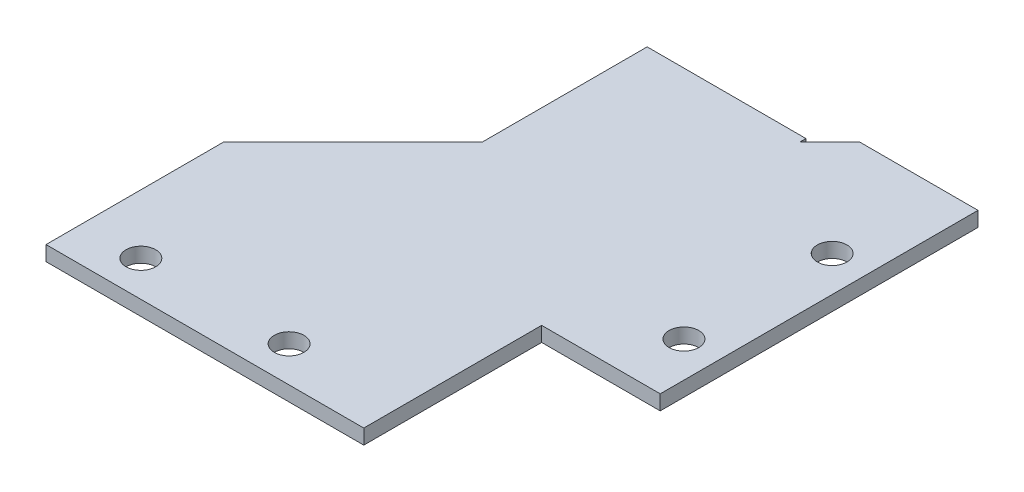
ISO-10303-21;
HEADER;
FILE_DESCRIPTION(('STEP AP214'),'2;1');
FILE_NAME('part.step','',(''),(''),'','','');
FILE_SCHEMA(('AUTOMOTIVE_DESIGN { 1 0 10303 214 1 1 1 1 }'));
ENDSEC;
DATA;
#1=APPLICATION_CONTEXT('core data for automotive mechanical design processes');
#2=APPLICATION_PROTOCOL_DEFINITION('international standard','automotive_design',2000,#1);
#3=PRODUCT_CONTEXT('',#1,'mechanical');
#4=PRODUCT('Part','Part','',(#3));
#5=PRODUCT_RELATED_PRODUCT_CATEGORY('part','',(#4));
#6=PRODUCT_DEFINITION_FORMATION('','',#4);
#7=PRODUCT_DEFINITION_CONTEXT('part definition',#1,'design');
#8=PRODUCT_DEFINITION('design','',#6,#7);
#9=PRODUCT_DEFINITION_SHAPE('','',#8);
#10=(LENGTH_UNIT() NAMED_UNIT(*) SI_UNIT(.MILLI.,.METRE.));
#11=(NAMED_UNIT(*) PLANE_ANGLE_UNIT() SI_UNIT($,.RADIAN.));
#12=(NAMED_UNIT(*) SI_UNIT($,.STERADIAN.) SOLID_ANGLE_UNIT());
#13=UNCERTAINTY_MEASURE_WITH_UNIT(LENGTH_MEASURE(1.E-05),#10,'distance_accuracy_value','');
#14=(GEOMETRIC_REPRESENTATION_CONTEXT(3) GLOBAL_UNCERTAINTY_ASSIGNED_CONTEXT((#13)) GLOBAL_UNIT_ASSIGNED_CONTEXT((#10,
#11,#12)) REPRESENTATION_CONTEXT('',''));
#15=CARTESIAN_POINT('',(0.,0.,0.));
#16=DIRECTION('',(0.,0.,1.));
#17=DIRECTION('',(1.,0.,0.));
#18=AXIS2_PLACEMENT_3D('',#15,#16,#17);
#19=CARTESIAN_POINT('',(-19.05,3.175,-19.05));
#20=DIRECTION('',(-0.707106781186548,0.,-0.707106781186548));
#21=DIRECTION('',(-0.707106781186548,0.,0.707106781186548));
#22=AXIS2_PLACEMENT_3D('',#19,#20,#21);
#23=PLANE('',#22);
#24=DIRECTION('',(0.,1.,0.));
#25=VECTOR('',#24,1.);
#26=CARTESIAN_POINT('',(27.7114,3.175,-65.8114));
#27=LINE('',#26,#25);
#28=CARTESIAN_POINT('',(27.7114,0.,-65.8114));
#29=VERTEX_POINT('',#28);
#30=CARTESIAN_POINT('',(27.7114,3.175,-65.8114));
#31=VERTEX_POINT('',#30);
#32=EDGE_CURVE('E167',#29,#31,#27,.T.);
#33=ORIENTED_EDGE('',*,*,#32,.F.);
#34=DIRECTION('',(0.707106781186548,0.,-0.707106781186548));
#35=VECTOR('',#34,1.);
#36=CARTESIAN_POINT('',(-19.05,0.,-19.05));
#37=LINE('',#36,#35);
#38=CARTESIAN_POINT('',(0.,0.,-38.1));
#39=VERTEX_POINT('',#38);
#40=EDGE_CURVE('E232',#39,#29,#37,.T.);
#41=ORIENTED_EDGE('',*,*,#40,.F.);
#42=DIRECTION('',(0.,-1.,0.));
#43=VECTOR('',#42,1.);
#44=CARTESIAN_POINT('',(0.,3.175,-38.1));
#45=LINE('',#44,#43);
#46=CARTESIAN_POINT('',(0.,3.175,-38.1));
#47=VERTEX_POINT('',#46);
#48=EDGE_CURVE('E238',#47,#39,#45,.T.);
#49=ORIENTED_EDGE('',*,*,#48,.F.);
#50=DIRECTION('',(0.707106781186548,0.,-0.707106781186548));
#51=VECTOR('',#50,1.);
#52=CARTESIAN_POINT('',(-19.05,3.175,-19.05));
#53=LINE('',#52,#51);
#54=EDGE_CURVE('E61',#47,#31,#53,.T.);
#55=ORIENTED_EDGE('',*,*,#54,.T.);
#56=EDGE_LOOP('',(#33,#41,#49,#55));
#57=FACE_BOUND('',#56,.T.);
#58=ADVANCED_FACE('F45',(#57),#23,.T.);
#59=CARTESIAN_POINT('',(0.,3.175,0.));
#60=DIRECTION('',(0.,0.,-1.));
#61=DIRECTION('',(-1.,0.,0.));
#62=AXIS2_PLACEMENT_3D('',#59,#60,#61);
#63=PLANE('',#62);
#64=DIRECTION('',(1.,0.,0.));
#65=VECTOR('',#64,1.);
#66=CARTESIAN_POINT('',(0.,0.,0.));
#67=LINE('',#66,#65);
#68=CARTESIAN_POINT('',(0.,0.,0.));
#69=VERTEX_POINT('',#68);
#70=CARTESIAN_POINT('',(68.072,0.,0.));
#71=VERTEX_POINT('',#70);
#72=EDGE_CURVE('E193',#69,#71,#67,.T.);
#73=ORIENTED_EDGE('',*,*,#72,.T.);
#74=DIRECTION('',(0.,-1.,0.));
#75=VECTOR('',#74,1.);
#76=CARTESIAN_POINT('',(68.072,3.175,0.));
#77=LINE('',#76,#75);
#78=CARTESIAN_POINT('',(68.072,3.175,0.));
#79=VERTEX_POINT('',#78);
#80=EDGE_CURVE('E11',#79,#71,#77,.T.);
#81=ORIENTED_EDGE('',*,*,#80,.F.);
#82=DIRECTION('',(1.,0.,0.));
#83=VECTOR('',#82,1.);
#84=CARTESIAN_POINT('',(0.,3.175,0.));
#85=LINE('',#84,#83);
#86=CARTESIAN_POINT('',(0.,3.175,0.));
#87=VERTEX_POINT('',#86);
#88=EDGE_CURVE('E196',#87,#79,#85,.T.);
#89=ORIENTED_EDGE('',*,*,#88,.F.);
#90=DIRECTION('',(0.,-1.,0.));
#91=VECTOR('',#90,1.);
#92=CARTESIAN_POINT('',(0.,3.175,0.));
#93=LINE('',#92,#91);
#94=EDGE_CURVE('E217',#87,#69,#93,.T.);
#95=ORIENTED_EDGE('',*,*,#94,.T.);
#96=EDGE_LOOP('',(#73,#81,#89,#95));
#97=FACE_BOUND('',#96,.T.);
#98=ADVANCED_FACE('F47',(#97),#63,.F.);
#99=CARTESIAN_POINT('',(68.072,3.175,0.));
#100=DIRECTION('',(-1.,0.,0.));
#101=DIRECTION('',(0.,0.,1.));
#102=AXIS2_PLACEMENT_3D('',#99,#100,#101);
#103=PLANE('',#102);
#104=DIRECTION('',(0.,0.,-1.));
#105=VECTOR('',#104,1.);
#106=CARTESIAN_POINT('',(68.072,0.,0.));
#107=LINE('',#106,#105);
#108=CARTESIAN_POINT('',(68.072,0.,-38.1));
#109=VERTEX_POINT('',#108);
#110=EDGE_CURVE('E221',#71,#109,#107,.T.);
#111=ORIENTED_EDGE('',*,*,#110,.T.);
#112=DIRECTION('',(0.,-1.,0.));
#113=VECTOR('',#112,1.);
#114=CARTESIAN_POINT('',(68.072,3.175,-38.1));
#115=LINE('',#114,#113);
#116=CARTESIAN_POINT('',(68.072,3.175,-38.1));
#117=VERTEX_POINT('',#116);
#118=EDGE_CURVE('E54',#117,#109,#115,.T.);
#119=ORIENTED_EDGE('',*,*,#118,.F.);
#120=DIRECTION('',(0.,0.,-1.));
#121=VECTOR('',#120,1.);
#122=CARTESIAN_POINT('',(68.072,3.175,0.));
#123=LINE('',#122,#121);
#124=EDGE_CURVE('E200',#79,#117,#123,.T.);
#125=ORIENTED_EDGE('',*,*,#124,.F.);
#126=ORIENTED_EDGE('',*,*,#80,.T.);
#127=EDGE_LOOP('',(#111,#119,#125,#126));
#128=FACE_BOUND('',#127,.T.);
#129=ADVANCED_FACE('F268',(#128),#103,.F.);
#130=CARTESIAN_POINT('',(0.,3.175,-38.1));
#131=DIRECTION('',(0.,0.,-1.));
#132=DIRECTION('',(-1.,0.,0.));
#133=AXIS2_PLACEMENT_3D('',#130,#131,#132);
#134=PLANE('',#133);
#135=DIRECTION('',(1.,0.,0.));
#136=VECTOR('',#135,1.);
#137=CARTESIAN_POINT('',(0.,0.,-38.1));
#138=LINE('',#137,#136);
#139=CARTESIAN_POINT('',(93.472,0.,-38.1));
#140=VERTEX_POINT('',#139);
#141=EDGE_CURVE('E224',#109,#140,#138,.T.);
#142=ORIENTED_EDGE('',*,*,#141,.T.);
#143=DIRECTION('',(0.,-1.,0.));
#144=VECTOR('',#143,1.);
#145=CARTESIAN_POINT('',(93.472,3.175,-38.1));
#146=LINE('',#145,#144);
#147=CARTESIAN_POINT('',(93.472,3.175,-38.1));
#148=VERTEX_POINT('',#147);
#149=EDGE_CURVE('E244',#148,#140,#146,.T.);
#150=ORIENTED_EDGE('',*,*,#149,.F.);
#151=DIRECTION('',(1.,0.,0.));
#152=VECTOR('',#151,1.);
#153=CARTESIAN_POINT('',(0.,3.175,-38.1));
#154=LINE('',#153,#152);
#155=EDGE_CURVE('E204',#117,#148,#154,.T.);
#156=ORIENTED_EDGE('',*,*,#155,.F.);
#157=ORIENTED_EDGE('',*,*,#118,.T.);
#158=EDGE_LOOP('',(#142,#150,#156,#157));
#159=FACE_BOUND('',#158,.T.);
#160=ADVANCED_FACE('F251',(#159),#134,.F.);
#161=CARTESIAN_POINT('',(93.472,3.175,0.));
#162=DIRECTION('',(-1.,0.,0.));
#163=DIRECTION('',(0.,0.,1.));
#164=AXIS2_PLACEMENT_3D('',#161,#162,#163);
#165=PLANE('',#164);
#166=DIRECTION('',(0.,0.,-1.));
#167=VECTOR('',#166,1.);
#168=CARTESIAN_POINT('',(93.472,0.,0.));
#169=LINE('',#168,#167);
#170=CARTESIAN_POINT('',(93.472,0.,-106.172));
#171=VERTEX_POINT('',#170);
#172=EDGE_CURVE('E226',#140,#171,#169,.T.);
#173=ORIENTED_EDGE('',*,*,#172,.T.);
#174=DIRECTION('',(0.,-1.,0.));
#175=VECTOR('',#174,1.);
#176=CARTESIAN_POINT('',(93.472,3.175,-106.172));
#177=LINE('',#176,#175);
#178=CARTESIAN_POINT('',(93.472,3.175,-106.172));
#179=VERTEX_POINT('',#178);
#180=EDGE_CURVE('E242',#179,#171,#177,.T.);
#181=ORIENTED_EDGE('',*,*,#180,.F.);
#182=DIRECTION('',(0.,0.,-1.));
#183=VECTOR('',#182,1.);
#184=CARTESIAN_POINT('',(93.472,3.175,0.));
#185=LINE('',#184,#183);
#186=EDGE_CURVE('E206',#148,#179,#185,.T.);
#187=ORIENTED_EDGE('',*,*,#186,.F.);
#188=ORIENTED_EDGE('',*,*,#149,.T.);
#189=EDGE_LOOP('',(#173,#181,#187,#188));
#190=FACE_BOUND('',#189,.T.);
#191=ADVANCED_FACE('F259',(#190),#165,.F.);
#192=CARTESIAN_POINT('',(0.,3.175,-106.172));
#193=DIRECTION('',(0.,0.,-1.));
#194=DIRECTION('',(-1.,0.,0.));
#195=AXIS2_PLACEMENT_3D('',#192,#193,#194);
#196=PLANE('',#195);
#197=DIRECTION('',(1.,0.,0.));
#198=VECTOR('',#197,1.);
#199=CARTESIAN_POINT('',(0.,0.,-106.172));
#200=LINE('',#199,#198);
#201=CARTESIAN_POINT('',(68.072,0.,-106.172));
#202=VERTEX_POINT('',#201);
#203=EDGE_CURVE('E229',#202,#171,#200,.T.);
#204=ORIENTED_EDGE('',*,*,#203,.F.);
#205=DIRECTION('',(0.,-1.,0.));
#206=VECTOR('',#205,1.);
#207=CARTESIAN_POINT('',(68.072,3.175,-106.172));
#208=LINE('',#207,#206);
#209=CARTESIAN_POINT('',(68.072,3.175,-106.172));
#210=VERTEX_POINT('',#209);
#211=EDGE_CURVE('E240',#210,#202,#208,.T.);
#212=ORIENTED_EDGE('',*,*,#211,.F.);
#213=DIRECTION('',(1.,0.,0.));
#214=VECTOR('',#213,1.);
#215=CARTESIAN_POINT('',(0.,3.175,-106.172));
#216=LINE('',#215,#214);
#217=EDGE_CURVE('E208',#210,#179,#216,.T.);
#218=ORIENTED_EDGE('',*,*,#217,.T.);
#219=ORIENTED_EDGE('',*,*,#180,.T.);
#220=EDGE_LOOP('',(#204,#212,#218,#219));
#221=FACE_BOUND('',#220,.T.);
#222=ADVANCED_FACE('F280',(#221),#196,.T.);
#223=DIRECTION('',(0.,-1.,0.));
#224=VECTOR('',#223,1.);
#225=CARTESIAN_POINT('',(61.722,3.175,-99.822));
#226=LINE('',#225,#224);
#227=CARTESIAN_POINT('',(61.722,3.175,-99.822));
#228=VERTEX_POINT('',#227);
#229=CARTESIAN_POINT('',(61.722,0.,-99.822));
#230=VERTEX_POINT('',#229);
#231=EDGE_CURVE('E138',#228,#230,#226,.T.);
#232=ORIENTED_EDGE('',*,*,#231,.F.);
#233=EDGE_CURVE('E211',#228,#210,#53,.T.);
#234=ORIENTED_EDGE('',*,*,#233,.T.);
#235=ORIENTED_EDGE('',*,*,#211,.T.);
#236=EDGE_CURVE('E69',#230,#202,#37,.T.);
#237=ORIENTED_EDGE('',*,*,#236,.F.);
#238=EDGE_LOOP('',(#232,#234,#235,#237));
#239=FACE_BOUND('',#238,.T.);
#240=ADVANCED_FACE('F278',(#239),#23,.T.);
#241=CARTESIAN_POINT('',(0.,3.175,0.));
#242=DIRECTION('',(-1.,0.,0.));
#243=DIRECTION('',(0.,0.,1.));
#244=AXIS2_PLACEMENT_3D('',#241,#242,#243);
#245=PLANE('',#244);
#246=DIRECTION('',(0.,0.,-1.));
#247=VECTOR('',#246,1.);
#248=CARTESIAN_POINT('',(0.,0.,0.));
#249=LINE('',#248,#247);
#250=EDGE_CURVE('E201',#69,#39,#249,.T.);
#251=ORIENTED_EDGE('',*,*,#250,.F.);
#252=ORIENTED_EDGE('',*,*,#94,.F.);
#253=DIRECTION('',(0.,0.,-1.));
#254=VECTOR('',#253,1.);
#255=CARTESIAN_POINT('',(0.,3.175,0.));
#256=LINE('',#255,#254);
#257=EDGE_CURVE('E214',#87,#47,#256,.T.);
#258=ORIENTED_EDGE('',*,*,#257,.T.);
#259=ORIENTED_EDGE('',*,*,#48,.T.);
#260=EDGE_LOOP('',(#251,#252,#258,#259));
#261=FACE_BOUND('',#260,.T.);
#262=ADVANCED_FACE('F272',(#261),#245,.T.);
#263=CARTESIAN_POINT('',(0.,3.175,0.));
#264=DIRECTION('',(0.,1.,0.));
#265=DIRECTION('',(0.,0.,1.));
#266=AXIS2_PLACEMENT_3D('',#263,#264,#265);
#267=PLANE('',#266);
#268=ORIENTED_EDGE('',*,*,#233,.F.);
#269=DIRECTION('',(0.,0.,-1.));
#270=VECTOR('',#269,1.);
#271=CARTESIAN_POINT('',(61.722,3.175,-46.5226302448016));
#272=LINE('',#271,#270);
#273=CARTESIAN_POINT('',(61.722,3.175,-101.064644568496));
#274=VERTEX_POINT('',#273);
#275=EDGE_CURVE('E162',#228,#274,#272,.T.);
#276=ORIENTED_EDGE('',*,*,#275,.T.);
#277=DIRECTION('',(-1.,0.,0.));
#278=VECTOR('',#277,1.);
#279=CARTESIAN_POINT('',(27.7114,3.175,-101.064644568496));
#280=LINE('',#279,#278);
#281=CARTESIAN_POINT('',(27.7114,3.175,-101.064644568496));
#282=VERTEX_POINT('',#281);
#283=EDGE_CURVE('E148',#274,#282,#280,.T.);
#284=ORIENTED_EDGE('',*,*,#283,.T.);
#285=DIRECTION('',(0.,0.,1.));
#286=VECTOR('',#285,1.);
#287=CARTESIAN_POINT('',(27.7114,3.175,-46.5226302448016));
#288=LINE('',#287,#286);
#289=EDGE_CURVE('E159',#282,#31,#288,.T.);
#290=ORIENTED_EDGE('',*,*,#289,.T.);
#291=ORIENTED_EDGE('',*,*,#54,.F.);
#292=ORIENTED_EDGE('',*,*,#257,.F.);
#293=ORIENTED_EDGE('',*,*,#88,.T.);
#294=ORIENTED_EDGE('',*,*,#124,.T.);
#295=ORIENTED_EDGE('',*,*,#155,.T.);
#296=ORIENTED_EDGE('',*,*,#186,.T.);
#297=ORIENTED_EDGE('',*,*,#217,.F.);
#298=EDGE_LOOP('',(#268,#276,#284,#290,#291,#292,#293,#294,#295,#296,#297));
#299=FACE_BOUND('',#298,.T.);
#300=CARTESIAN_POINT('',(85.8519999999999,3.175,-82.55));
#301=DIRECTION('',(0.,1.,0.));
#302=DIRECTION('',(0.,0.,1.));
#303=AXIS2_PLACEMENT_3D('',#300,#301,#302);
#304=CIRCLE('',#303,3.175);
#305=CARTESIAN_POINT('',(85.8519999999999,3.175,-79.375));
#306=VERTEX_POINT('',#305);
#307=EDGE_CURVE('E169',#306,#306,#304,.T.);
#308=ORIENTED_EDGE('',*,*,#307,.F.);
#309=EDGE_LOOP('',(#308));
#310=FACE_BOUND('',#309,.T.);
#311=CARTESIAN_POINT('',(85.852,3.175,-50.8));
#312=DIRECTION('',(0.,1.,0.));
#313=DIRECTION('',(0.,0.,1.));
#314=AXIS2_PLACEMENT_3D('',#311,#312,#313);
#315=CIRCLE('',#314,3.175);
#316=CARTESIAN_POINT('',(85.852,3.175,-47.625));
#317=VERTEX_POINT('',#316);
#318=EDGE_CURVE('E173',#317,#317,#315,.T.);
#319=ORIENTED_EDGE('',*,*,#318,.F.);
#320=EDGE_LOOP('',(#319));
#321=FACE_BOUND('',#320,.T.);
#322=CARTESIAN_POINT('',(44.45,3.175,-7.62));
#323=DIRECTION('',(0.,1.,0.));
#324=DIRECTION('',(0.,0.,1.));
#325=AXIS2_PLACEMENT_3D('',#322,#323,#324);
#326=CIRCLE('',#325,3.175);
#327=CARTESIAN_POINT('',(44.45,3.175,-4.445));
#328=VERTEX_POINT('',#327);
#329=EDGE_CURVE('E179',#328,#328,#326,.T.);
#330=ORIENTED_EDGE('',*,*,#329,.F.);
#331=EDGE_LOOP('',(#330));
#332=FACE_BOUND('',#331,.T.);
#333=CARTESIAN_POINT('',(12.7,3.175,-7.62));
#334=DIRECTION('',(0.,1.,0.));
#335=DIRECTION('',(0.,0.,1.));
#336=AXIS2_PLACEMENT_3D('',#333,#334,#335);
#337=CIRCLE('',#336,3.175);
#338=CARTESIAN_POINT('',(12.7,3.175,-4.445));
#339=VERTEX_POINT('',#338);
#340=EDGE_CURVE('E186',#339,#339,#337,.T.);
#341=ORIENTED_EDGE('',*,*,#340,.F.);
#342=EDGE_LOOP('',(#341));
#343=FACE_BOUND('',#342,.T.);
#344=ADVANCED_FACE('F263',(#299,#310,#321,#332,#343),#267,.T.);
#345=CARTESIAN_POINT('',(0.,0.,0.));
#346=DIRECTION('',(0.,1.,0.));
#347=DIRECTION('',(0.,0.,1.));
#348=AXIS2_PLACEMENT_3D('',#345,#346,#347);
#349=PLANE('',#348);
#350=ORIENTED_EDGE('',*,*,#40,.T.);
#351=DIRECTION('',(0.,0.,1.));
#352=VECTOR('',#351,1.);
#353=CARTESIAN_POINT('',(27.7114,0.,-46.5226302448016));
#354=LINE('',#353,#352);
#355=CARTESIAN_POINT('',(27.7114,0.,-101.064644568496));
#356=VERTEX_POINT('',#355);
#357=EDGE_CURVE('E142',#356,#29,#354,.T.);
#358=ORIENTED_EDGE('',*,*,#357,.F.);
#359=DIRECTION('',(-1.,0.,0.));
#360=VECTOR('',#359,1.);
#361=CARTESIAN_POINT('',(27.7114,0.,-101.064644568496));
#362=LINE('',#361,#360);
#363=CARTESIAN_POINT('',(61.722,0.,-101.064644568496));
#364=VERTEX_POINT('',#363);
#365=EDGE_CURVE('E141',#364,#356,#362,.T.);
#366=ORIENTED_EDGE('',*,*,#365,.F.);
#367=DIRECTION('',(0.,0.,-1.));
#368=VECTOR('',#367,1.);
#369=CARTESIAN_POINT('',(61.722,0.,-46.5226302448016));
#370=LINE('',#369,#368);
#371=EDGE_CURVE('E132',#230,#364,#370,.T.);
#372=ORIENTED_EDGE('',*,*,#371,.F.);
#373=ORIENTED_EDGE('',*,*,#236,.T.);
#374=ORIENTED_EDGE('',*,*,#203,.T.);
#375=ORIENTED_EDGE('',*,*,#172,.F.);
#376=ORIENTED_EDGE('',*,*,#141,.F.);
#377=ORIENTED_EDGE('',*,*,#110,.F.);
#378=ORIENTED_EDGE('',*,*,#72,.F.);
#379=ORIENTED_EDGE('',*,*,#250,.T.);
#380=EDGE_LOOP('',(#350,#358,#366,#372,#373,#374,#375,#376,#377,#378,#379));
#381=FACE_BOUND('',#380,.T.);
#382=CARTESIAN_POINT('',(85.8519999999999,0.,-82.55));
#383=DIRECTION('',(0.,1.,0.));
#384=DIRECTION('',(0.,0.,1.));
#385=AXIS2_PLACEMENT_3D('',#382,#383,#384);
#386=CIRCLE('',#385,3.175);
#387=CARTESIAN_POINT('',(85.8519999999999,0.,-79.375));
#388=VERTEX_POINT('',#387);
#389=EDGE_CURVE('E170',#388,#388,#386,.T.);
#390=ORIENTED_EDGE('',*,*,#389,.T.);
#391=EDGE_LOOP('',(#390));
#392=FACE_BOUND('',#391,.T.);
#393=CARTESIAN_POINT('',(85.852,0.,-50.8));
#394=DIRECTION('',(0.,1.,0.));
#395=DIRECTION('',(0.,0.,1.));
#396=AXIS2_PLACEMENT_3D('',#393,#394,#395);
#397=CIRCLE('',#396,3.175);
#398=CARTESIAN_POINT('',(85.852,0.,-47.625));
#399=VERTEX_POINT('',#398);
#400=EDGE_CURVE('E176',#399,#399,#397,.T.);
#401=ORIENTED_EDGE('',*,*,#400,.T.);
#402=EDGE_LOOP('',(#401));
#403=FACE_BOUND('',#402,.T.);
#404=CARTESIAN_POINT('',(44.45,0.,-7.62));
#405=DIRECTION('',(0.,1.,0.));
#406=DIRECTION('',(0.,0.,1.));
#407=AXIS2_PLACEMENT_3D('',#404,#405,#406);
#408=CIRCLE('',#407,3.175);
#409=CARTESIAN_POINT('',(44.45,0.,-4.445));
#410=VERTEX_POINT('',#409);
#411=EDGE_CURVE('E182',#410,#410,#408,.T.);
#412=ORIENTED_EDGE('',*,*,#411,.T.);
#413=EDGE_LOOP('',(#412));
#414=FACE_BOUND('',#413,.T.);
#415=CARTESIAN_POINT('',(12.7,0.,-7.62));
#416=DIRECTION('',(0.,1.,0.));
#417=DIRECTION('',(0.,0.,1.));
#418=AXIS2_PLACEMENT_3D('',#415,#416,#417);
#419=CIRCLE('',#418,3.175);
#420=CARTESIAN_POINT('',(12.7,0.,-4.445));
#421=VERTEX_POINT('',#420);
#422=EDGE_CURVE('E190',#421,#421,#419,.T.);
#423=ORIENTED_EDGE('',*,*,#422,.T.);
#424=EDGE_LOOP('',(#423));
#425=FACE_BOUND('',#424,.T.);
#426=ADVANCED_FACE('F153',(#381,#392,#403,#414,#425),#349,.F.);
#427=CARTESIAN_POINT('',(12.7,0.,-7.62));
#428=DIRECTION('',(0.,1.,0.));
#429=DIRECTION('',(0.,0.,1.));
#430=AXIS2_PLACEMENT_3D('',#427,#428,#429);
#431=CYLINDRICAL_SURFACE('',#430,3.175);
#432=ORIENTED_EDGE('',*,*,#422,.F.);
#433=EDGE_LOOP('',(#432));
#434=FACE_BOUND('',#433,.T.);
#435=ORIENTED_EDGE('',*,*,#340,.T.);
#436=EDGE_LOOP('',(#435));
#437=FACE_BOUND('',#436,.T.);
#438=ADVANCED_FACE('F324',(#434,#437),#431,.F.);
#439=CARTESIAN_POINT('',(44.45,0.,-7.62));
#440=DIRECTION('',(0.,1.,0.));
#441=DIRECTION('',(0.,0.,1.));
#442=AXIS2_PLACEMENT_3D('',#439,#440,#441);
#443=CYLINDRICAL_SURFACE('',#442,3.175);
#444=ORIENTED_EDGE('',*,*,#411,.F.);
#445=EDGE_LOOP('',(#444));
#446=FACE_BOUND('',#445,.T.);
#447=ORIENTED_EDGE('',*,*,#329,.T.);
#448=EDGE_LOOP('',(#447));
#449=FACE_BOUND('',#448,.T.);
#450=ADVANCED_FACE('F329',(#446,#449),#443,.F.);
#451=CARTESIAN_POINT('',(85.852,0.,-50.8));
#452=DIRECTION('',(0.,1.,0.));
#453=DIRECTION('',(0.,0.,1.));
#454=AXIS2_PLACEMENT_3D('',#451,#452,#453);
#455=CYLINDRICAL_SURFACE('',#454,3.175);
#456=ORIENTED_EDGE('',*,*,#400,.F.);
#457=EDGE_LOOP('',(#456));
#458=FACE_BOUND('',#457,.T.);
#459=ORIENTED_EDGE('',*,*,#318,.T.);
#460=EDGE_LOOP('',(#459));
#461=FACE_BOUND('',#460,.T.);
#462=ADVANCED_FACE('F341',(#458,#461),#455,.F.);
#463=CARTESIAN_POINT('',(85.8519999999999,0.,-82.55));
#464=DIRECTION('',(0.,1.,0.));
#465=DIRECTION('',(0.,0.,1.));
#466=AXIS2_PLACEMENT_3D('',#463,#464,#465);
#467=CYLINDRICAL_SURFACE('',#466,3.175);
#468=ORIENTED_EDGE('',*,*,#389,.F.);
#469=EDGE_LOOP('',(#468));
#470=FACE_BOUND('',#469,.T.);
#471=ORIENTED_EDGE('',*,*,#307,.T.);
#472=EDGE_LOOP('',(#471));
#473=FACE_BOUND('',#472,.T.);
#474=ADVANCED_FACE('F351',(#470,#473),#467,.F.);
#475=CARTESIAN_POINT('',(27.7114,0.,-46.5226302448016));
#476=DIRECTION('',(-1.,0.,0.));
#477=DIRECTION('',(0.,0.,1.));
#478=AXIS2_PLACEMENT_3D('',#475,#476,#477);
#479=PLANE('',#478);
#480=ORIENTED_EDGE('',*,*,#357,.T.);
#481=ORIENTED_EDGE('',*,*,#32,.T.);
#482=ORIENTED_EDGE('',*,*,#289,.F.);
#483=DIRECTION('',(0.,1.,0.));
#484=VECTOR('',#483,1.);
#485=CARTESIAN_POINT('',(27.7114,0.,-101.064644568496));
#486=LINE('',#485,#484);
#487=EDGE_CURVE('E149',#356,#282,#486,.T.);
#488=ORIENTED_EDGE('',*,*,#487,.F.);
#489=EDGE_LOOP('',(#480,#481,#482,#488));
#490=FACE_BOUND('',#489,.T.);
#491=ADVANCED_FACE('F275',(#490),#479,.T.);
#492=CARTESIAN_POINT('',(27.7114,0.,-101.064644568496));
#493=DIRECTION('',(0.,0.,-1.));
#494=DIRECTION('',(-1.,0.,0.));
#495=AXIS2_PLACEMENT_3D('',#492,#493,#494);
#496=PLANE('',#495);
#497=ORIENTED_EDGE('',*,*,#283,.F.);
#498=DIRECTION('',(0.,1.,0.));
#499=VECTOR('',#498,1.);
#500=CARTESIAN_POINT('',(61.722,0.,-101.064644568496));
#501=LINE('',#500,#499);
#502=EDGE_CURVE('E136',#364,#274,#501,.T.);
#503=ORIENTED_EDGE('',*,*,#502,.F.);
#504=ORIENTED_EDGE('',*,*,#365,.T.);
#505=ORIENTED_EDGE('',*,*,#487,.T.);
#506=EDGE_LOOP('',(#497,#503,#504,#505));
#507=FACE_BOUND('',#506,.T.);
#508=ADVANCED_FACE('F146',(#507),#496,.T.);
#509=CARTESIAN_POINT('',(61.722,0.,-46.5226302448016));
#510=DIRECTION('',(1.,0.,0.));
#511=DIRECTION('',(0.,0.,-1.));
#512=AXIS2_PLACEMENT_3D('',#509,#510,#511);
#513=PLANE('',#512);
#514=ORIENTED_EDGE('',*,*,#275,.F.);
#515=ORIENTED_EDGE('',*,*,#231,.T.);
#516=ORIENTED_EDGE('',*,*,#371,.T.);
#517=ORIENTED_EDGE('',*,*,#502,.T.);
#518=EDGE_LOOP('',(#514,#515,#516,#517));
#519=FACE_BOUND('',#518,.T.);
#520=ADVANCED_FACE('F135',(#519),#513,.T.);
#521=CLOSED_SHELL('',(#58,#98,#129,#160,#191,#222,#240,#262,#344,#426,#438,#450,#462,#474,#491,
#508,#520));
#522=MANIFOLD_SOLID_BREP('B2',#521);
#523=ADVANCED_BREP_SHAPE_REPRESENTATION('',(#18,#522),#14);
#524=SHAPE_DEFINITION_REPRESENTATION(#9,#523);
ENDSEC;
END-ISO-10303-21;
